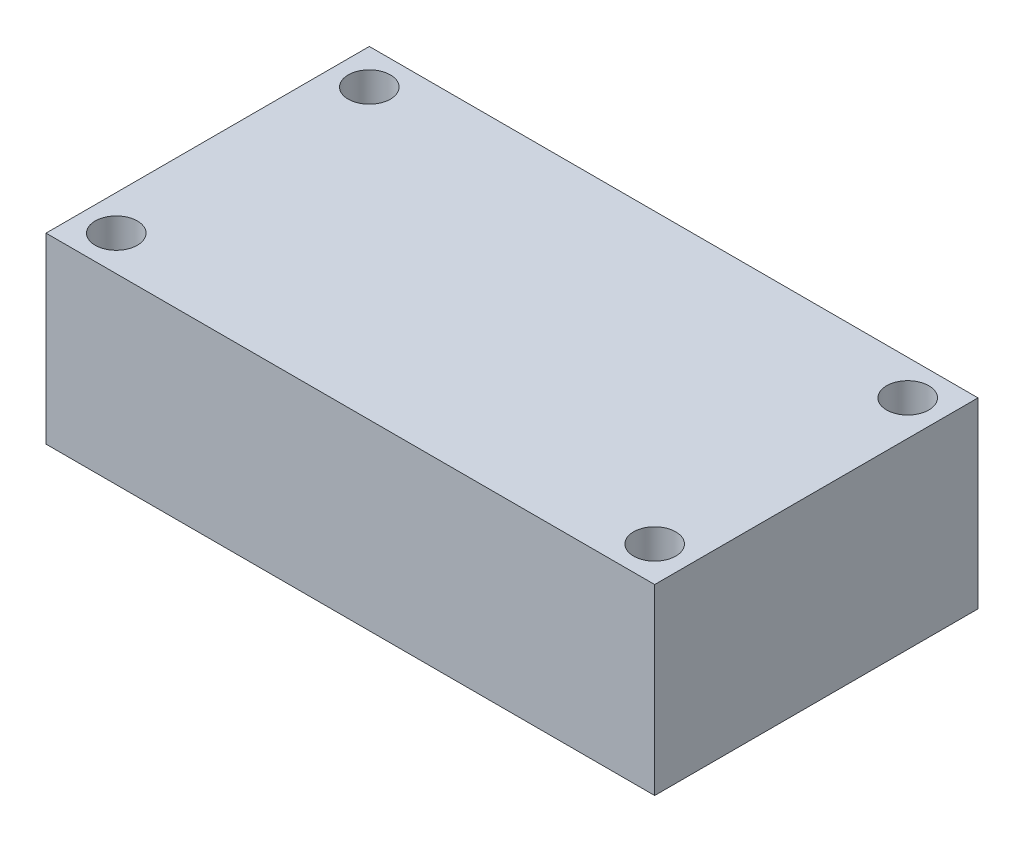
ISO-10303-21;
HEADER;
FILE_DESCRIPTION(('STEP AP214'),'2;1');
FILE_NAME('part.step','',(''),(''),'','','');
FILE_SCHEMA(('AUTOMOTIVE_DESIGN { 1 0 10303 214 1 1 1 1 }'));
ENDSEC;
DATA;
#1=APPLICATION_CONTEXT('core data for automotive mechanical design processes');
#2=APPLICATION_PROTOCOL_DEFINITION('international standard','automotive_design',2000,#1);
#3=PRODUCT_CONTEXT('',#1,'mechanical');
#4=PRODUCT('Part','Part','',(#3));
#5=PRODUCT_RELATED_PRODUCT_CATEGORY('part','',(#4));
#6=PRODUCT_DEFINITION_FORMATION('','',#4);
#7=PRODUCT_DEFINITION_CONTEXT('part definition',#1,'design');
#8=PRODUCT_DEFINITION('design','',#6,#7);
#9=PRODUCT_DEFINITION_SHAPE('','',#8);
#10=(LENGTH_UNIT() NAMED_UNIT(*) SI_UNIT(.MILLI.,.METRE.));
#11=(NAMED_UNIT(*) PLANE_ANGLE_UNIT() SI_UNIT($,.RADIAN.));
#12=(NAMED_UNIT(*) SI_UNIT($,.STERADIAN.) SOLID_ANGLE_UNIT());
#13=UNCERTAINTY_MEASURE_WITH_UNIT(LENGTH_MEASURE(1.E-05),#10,'distance_accuracy_value','');
#14=(GEOMETRIC_REPRESENTATION_CONTEXT(3) GLOBAL_UNCERTAINTY_ASSIGNED_CONTEXT((#13)) GLOBAL_UNIT_ASSIGNED_CONTEXT((#10,
#11,#12)) REPRESENTATION_CONTEXT('',''));
#15=CARTESIAN_POINT('',(0.,0.,0.));
#16=DIRECTION('',(0.,0.,1.));
#17=DIRECTION('',(1.,0.,0.));
#18=AXIS2_PLACEMENT_3D('',#15,#16,#17);
#19=CARTESIAN_POINT('',(0.,13.,0.));
#20=DIRECTION('',(0.,0.,-1.));
#21=DIRECTION('',(-1.,0.,0.));
#22=AXIS2_PLACEMENT_3D('',#19,#20,#21);
#23=PLANE('',#22);
#24=DIRECTION('',(1.,0.,0.));
#25=VECTOR('',#24,1.);
#26=CARTESIAN_POINT('',(0.,0.,0.));
#27=LINE('',#26,#25);
#28=CARTESIAN_POINT('',(0.,0.,0.));
#29=VERTEX_POINT('',#28);
#30=CARTESIAN_POINT('',(43.3,0.,0.));
#31=VERTEX_POINT('',#30);
#32=EDGE_CURVE('E131',#29,#31,#27,.T.);
#33=ORIENTED_EDGE('',*,*,#32,.T.);
#34=DIRECTION('',(0.,-1.,0.));
#35=VECTOR('',#34,1.);
#36=CARTESIAN_POINT('',(43.3,13.,0.));
#37=LINE('',#36,#35);
#38=CARTESIAN_POINT('',(43.3,13.,0.));
#39=VERTEX_POINT('',#38);
#40=EDGE_CURVE('E11',#39,#31,#37,.T.);
#41=ORIENTED_EDGE('',*,*,#40,.F.);
#42=DIRECTION('',(1.,0.,0.));
#43=VECTOR('',#42,1.);
#44=CARTESIAN_POINT('',(0.,13.,0.));
#45=LINE('',#44,#43);
#46=CARTESIAN_POINT('',(0.,13.,0.));
#47=VERTEX_POINT('',#46);
#48=EDGE_CURVE('E97',#47,#39,#45,.T.);
#49=ORIENTED_EDGE('',*,*,#48,.F.);
#50=DIRECTION('',(0.,-1.,0.));
#51=VECTOR('',#50,1.);
#52=CARTESIAN_POINT('',(0.,13.,0.));
#53=LINE('',#52,#51);
#54=EDGE_CURVE('E63',#47,#29,#53,.T.);
#55=ORIENTED_EDGE('',*,*,#54,.T.);
#56=EDGE_LOOP('',(#33,#41,#49,#55));
#57=FACE_BOUND('',#56,.T.);
#58=ADVANCED_FACE('F45',(#57),#23,.F.);
#59=CARTESIAN_POINT('',(43.3,13.,0.));
#60=DIRECTION('',(-1.,0.,0.));
#61=DIRECTION('',(0.,0.,1.));
#62=AXIS2_PLACEMENT_3D('',#59,#60,#61);
#63=PLANE('',#62);
#64=DIRECTION('',(0.,0.,-1.));
#65=VECTOR('',#64,1.);
#66=CARTESIAN_POINT('',(43.3,0.,0.));
#67=LINE('',#66,#65);
#68=CARTESIAN_POINT('',(43.3,0.,-23.));
#69=VERTEX_POINT('',#68);
#70=EDGE_CURVE('E103',#31,#69,#67,.T.);
#71=ORIENTED_EDGE('',*,*,#70,.T.);
#72=DIRECTION('',(0.,-1.,0.));
#73=VECTOR('',#72,1.);
#74=CARTESIAN_POINT('',(43.3,13.,-23.));
#75=LINE('',#74,#73);
#76=CARTESIAN_POINT('',(43.3,13.,-23.));
#77=VERTEX_POINT('',#76);
#78=EDGE_CURVE('E55',#77,#69,#75,.T.);
#79=ORIENTED_EDGE('',*,*,#78,.F.);
#80=DIRECTION('',(0.,0.,-1.));
#81=VECTOR('',#80,1.);
#82=CARTESIAN_POINT('',(43.3,13.,0.));
#83=LINE('',#82,#81);
#84=EDGE_CURVE('E88',#39,#77,#83,.T.);
#85=ORIENTED_EDGE('',*,*,#84,.F.);
#86=ORIENTED_EDGE('',*,*,#40,.T.);
#87=EDGE_LOOP('',(#71,#79,#85,#86));
#88=FACE_BOUND('',#87,.T.);
#89=ADVANCED_FACE('F102',(#88),#63,.F.);
#90=CARTESIAN_POINT('',(0.,13.,-23.));
#91=DIRECTION('',(0.,0.,-1.));
#92=DIRECTION('',(-1.,0.,0.));
#93=AXIS2_PLACEMENT_3D('',#90,#91,#92);
#94=PLANE('',#93);
#95=DIRECTION('',(1.,0.,0.));
#96=VECTOR('',#95,1.);
#97=CARTESIAN_POINT('',(0.,0.,-23.));
#98=LINE('',#97,#96);
#99=CARTESIAN_POINT('',(0.,0.,-23.));
#100=VERTEX_POINT('',#99);
#101=EDGE_CURVE('E136',#100,#69,#98,.T.);
#102=ORIENTED_EDGE('',*,*,#101,.F.);
#103=DIRECTION('',(0.,-1.,0.));
#104=VECTOR('',#103,1.);
#105=CARTESIAN_POINT('',(0.,13.,-23.));
#106=LINE('',#105,#104);
#107=CARTESIAN_POINT('',(0.,13.,-23.));
#108=VERTEX_POINT('',#107);
#109=EDGE_CURVE('E77',#108,#100,#106,.T.);
#110=ORIENTED_EDGE('',*,*,#109,.F.);
#111=DIRECTION('',(1.,0.,0.));
#112=VECTOR('',#111,1.);
#113=CARTESIAN_POINT('',(0.,13.,-23.));
#114=LINE('',#113,#112);
#115=EDGE_CURVE('E96',#108,#77,#114,.T.);
#116=ORIENTED_EDGE('',*,*,#115,.T.);
#117=ORIENTED_EDGE('',*,*,#78,.T.);
#118=EDGE_LOOP('',(#102,#110,#116,#117));
#119=FACE_BOUND('',#118,.T.);
#120=ADVANCED_FACE('F107',(#119),#94,.T.);
#121=CARTESIAN_POINT('',(0.,13.,0.));
#122=DIRECTION('',(-1.,0.,0.));
#123=DIRECTION('',(0.,0.,1.));
#124=AXIS2_PLACEMENT_3D('',#121,#122,#123);
#125=PLANE('',#124);
#126=DIRECTION('',(0.,0.,-1.));
#127=VECTOR('',#126,1.);
#128=CARTESIAN_POINT('',(0.,0.,0.));
#129=LINE('',#128,#127);
#130=EDGE_CURVE('E139',#29,#100,#129,.T.);
#131=ORIENTED_EDGE('',*,*,#130,.F.);
#132=ORIENTED_EDGE('',*,*,#54,.F.);
#133=DIRECTION('',(0.,0.,-1.));
#134=VECTOR('',#133,1.);
#135=CARTESIAN_POINT('',(0.,13.,0.));
#136=LINE('',#135,#134);
#137=EDGE_CURVE('E109',#47,#108,#136,.T.);
#138=ORIENTED_EDGE('',*,*,#137,.T.);
#139=ORIENTED_EDGE('',*,*,#109,.T.);
#140=EDGE_LOOP('',(#131,#132,#138,#139));
#141=FACE_BOUND('',#140,.T.);
#142=ADVANCED_FACE('F195',(#141),#125,.T.);
#143=CARTESIAN_POINT('',(2.5,13.,-20.5));
#144=DIRECTION('',(0.,-1.,0.));
#145=DIRECTION('',(0.,0.,-1.));
#146=AXIS2_PLACEMENT_3D('',#143,#144,#145);
#147=CYLINDRICAL_SURFACE('',#146,1.5);
#148=CARTESIAN_POINT('',(2.5,13.,-20.5));
#149=DIRECTION('',(0.,1.,0.));
#150=DIRECTION('',(0.,0.,1.));
#151=AXIS2_PLACEMENT_3D('',#148,#149,#150);
#152=CIRCLE('',#151,1.5);
#153=CARTESIAN_POINT('',(2.5,13.,-22.));
#154=VERTEX_POINT('',#153);
#155=EDGE_CURVE('E161',#154,#154,#152,.T.);
#156=CARTESIAN_POINT('',(2.5,0.,-20.5));
#157=DIRECTION('',(0.,1.,0.));
#158=DIRECTION('',(0.,0.,1.));
#159=AXIS2_PLACEMENT_3D('',#156,#157,#158);
#160=CIRCLE('',#159,1.5);
#161=CARTESIAN_POINT('',(2.5,0.,-22.));
#162=VERTEX_POINT('',#161);
#163=EDGE_CURVE('E127',#162,#162,#160,.T.);
#164=CARTESIAN_POINT('',(2.5,13.,-22.));
#165=CARTESIAN_POINT('',(2.5,12.8645833333333,-22.));
#166=CARTESIAN_POINT('',(2.5,12.7291666666667,-22.));
#167=CARTESIAN_POINT('',(2.5,12.4583333333333,-22.));
#168=CARTESIAN_POINT('',(2.5,12.3229166666667,-22.));
#169=CARTESIAN_POINT('',(2.5,12.0520833333333,-22.));
#170=CARTESIAN_POINT('',(2.5,11.9166666666667,-22.));
#171=CARTESIAN_POINT('',(2.5,11.6458333333333,-22.));
#172=CARTESIAN_POINT('',(2.5,11.5104166666667,-22.));
#173=CARTESIAN_POINT('',(2.5,11.2395833333333,-22.));
#174=CARTESIAN_POINT('',(2.5,11.1041666666667,-22.));
#175=CARTESIAN_POINT('',(2.5,10.8333333333333,-22.));
#176=CARTESIAN_POINT('',(2.5,10.6979166666667,-22.));
#177=CARTESIAN_POINT('',(2.5,10.4270833333333,-22.));
#178=CARTESIAN_POINT('',(2.5,10.2916666666667,-22.));
#179=CARTESIAN_POINT('',(2.5,10.0208333333333,-22.));
#180=CARTESIAN_POINT('',(2.5,9.88541666666667,-22.));
#181=CARTESIAN_POINT('',(2.5,9.61458333333333,-22.));
#182=CARTESIAN_POINT('',(2.5,9.47916666666667,-22.));
#183=CARTESIAN_POINT('',(2.5,9.20833333333333,-22.));
#184=CARTESIAN_POINT('',(2.5,9.07291666666666,-22.));
#185=CARTESIAN_POINT('',(2.5,8.80208333333333,-22.));
#186=CARTESIAN_POINT('',(2.5,8.66666666666667,-22.));
#187=CARTESIAN_POINT('',(2.5,8.39583333333333,-22.));
#188=CARTESIAN_POINT('',(2.5,8.26041666666667,-22.));
#189=CARTESIAN_POINT('',(2.5,7.98958333333333,-22.));
#190=CARTESIAN_POINT('',(2.5,7.85416666666667,-22.));
#191=CARTESIAN_POINT('',(2.5,7.58333333333333,-22.));
#192=CARTESIAN_POINT('',(2.5,7.44791666666667,-22.));
#193=CARTESIAN_POINT('',(2.5,7.17708333333333,-22.));
#194=CARTESIAN_POINT('',(2.5,7.04166666666667,-22.));
#195=CARTESIAN_POINT('',(2.5,6.77083333333333,-22.));
#196=CARTESIAN_POINT('',(2.5,6.63541666666667,-22.));
#197=CARTESIAN_POINT('',(2.5,6.36458333333333,-22.));
#198=CARTESIAN_POINT('',(2.5,6.22916666666667,-22.));
#199=CARTESIAN_POINT('',(2.5,5.95833333333333,-22.));
#200=CARTESIAN_POINT('',(2.5,5.82291666666667,-22.));
#201=CARTESIAN_POINT('',(2.5,5.55208333333333,-22.));
#202=CARTESIAN_POINT('',(2.5,5.41666666666667,-22.));
#203=CARTESIAN_POINT('',(2.5,5.14583333333333,-22.));
#204=CARTESIAN_POINT('',(2.5,5.01041666666667,-22.));
#205=CARTESIAN_POINT('',(2.5,4.73958333333333,-22.));
#206=CARTESIAN_POINT('',(2.5,4.60416666666667,-22.));
#207=CARTESIAN_POINT('',(2.5,4.33333333333333,-22.));
#208=CARTESIAN_POINT('',(2.5,4.19791666666667,-22.));
#209=CARTESIAN_POINT('',(2.5,3.92708333333333,-22.));
#210=CARTESIAN_POINT('',(2.5,3.79166666666667,-22.));
#211=CARTESIAN_POINT('',(2.5,3.52083333333333,-22.));
#212=CARTESIAN_POINT('',(2.5,3.38541666666667,-22.));
#213=CARTESIAN_POINT('',(2.5,3.11458333333333,-22.));
#214=CARTESIAN_POINT('',(2.5,2.97916666666667,-22.));
#215=CARTESIAN_POINT('',(2.5,2.70833333333333,-22.));
#216=CARTESIAN_POINT('',(2.5,2.57291666666667,-22.));
#217=CARTESIAN_POINT('',(2.5,2.30208333333333,-22.));
#218=CARTESIAN_POINT('',(2.5,2.16666666666667,-22.));
#219=CARTESIAN_POINT('',(2.5,1.89583333333333,-22.));
#220=CARTESIAN_POINT('',(2.5,1.76041666666667,-22.));
#221=CARTESIAN_POINT('',(2.5,1.48958333333333,-22.));
#222=CARTESIAN_POINT('',(2.5,1.35416666666667,-22.));
#223=CARTESIAN_POINT('',(2.5,1.08333333333333,-22.));
#224=CARTESIAN_POINT('',(2.5,0.947916666666667,-22.));
#225=CARTESIAN_POINT('',(2.5,0.677083333333334,-22.));
#226=CARTESIAN_POINT('',(2.5,0.541666666666667,-22.));
#227=CARTESIAN_POINT('',(2.5,0.270833333333334,-22.));
#228=CARTESIAN_POINT('',(2.5,0.135416666666667,-22.));
#229=CARTESIAN_POINT('',(2.5,0.,-22.));
#230=B_SPLINE_CURVE_WITH_KNOTS('',3,(#164,#165,#166,#167,#168,#169,#170,#171,#172,#173,#174,
#175,#176,#177,#178,#179,#180,#181,#182,#183,#184,#185,#186,#187,#188,#189,#190,#191,#192,#193,
#194,#195,#196,#197,#198,#199,#200,#201,#202,#203,#204,#205,#206,#207,#208,#209,#210,#211,#212,
#213,#214,#215,#216,#217,#218,#219,#220,#221,#222,#223,#224,#225,#226,#227,#228,#229),
.UNSPECIFIED.,.F.,.F.,(4,2,2,2,2,2,2,2,2,2,2,2,2,2,2,2,2,2,2,2,2,2,2,2,2,2,2,2,2,2,2,2,4),(0.,
0.40625,0.812500000000001,1.21875,1.625,2.03125,2.4375,2.84375,3.25,3.65625,4.0625,4.46875,
4.875,5.28125,5.6875,6.09375,6.5,6.90625,7.3125,7.71875,8.125,8.53125,8.9375,9.34375,9.75,
10.15625,10.5625,10.96875,11.375,11.78125,12.1875,12.59375,13.),.UNSPECIFIED.);
#231=EDGE_CURVE('BSEAM169',#154,#162,#230,.T.);
#232=ORIENTED_EDGE('',*,*,#155,.T.);
#233=ORIENTED_EDGE('',*,*,#163,.F.);
#234=ORIENTED_EDGE('',*,*,#231,.T.);
#235=ORIENTED_EDGE('',*,*,#231,.F.);
#236=EDGE_LOOP('',(#232,#234,#233,#235));
#237=FACE_BOUND('',#236,.T.);
#238=ADVANCED_FACE('F169',(#237),#147,.F.);
#239=CARTESIAN_POINT('',(2.5,13.,-2.5));
#240=DIRECTION('',(0.,-1.,0.));
#241=DIRECTION('',(0.,0.,-1.));
#242=AXIS2_PLACEMENT_3D('',#239,#240,#241);
#243=CYLINDRICAL_SURFACE('',#242,1.5);
#244=CARTESIAN_POINT('',(2.5,13.,-2.5));
#245=DIRECTION('',(0.,1.,0.));
#246=DIRECTION('',(0.,0.,1.));
#247=AXIS2_PLACEMENT_3D('',#244,#245,#246);
#248=CIRCLE('',#247,1.5);
#249=CARTESIAN_POINT('',(2.5,13.,-4.));
#250=VERTEX_POINT('',#249);
#251=EDGE_CURVE('E155',#250,#250,#248,.T.);
#252=CARTESIAN_POINT('',(2.5,0.,-2.5));
#253=DIRECTION('',(0.,1.,0.));
#254=DIRECTION('',(0.,0.,1.));
#255=AXIS2_PLACEMENT_3D('',#252,#253,#254);
#256=CIRCLE('',#255,1.5);
#257=CARTESIAN_POINT('',(2.5,0.,-4.));
#258=VERTEX_POINT('',#257);
#259=EDGE_CURVE('E123',#258,#258,#256,.T.);
#260=CARTESIAN_POINT('',(2.5,13.,-4.));
#261=CARTESIAN_POINT('',(2.5,12.8645833333333,-4.));
#262=CARTESIAN_POINT('',(2.5,12.7291666666667,-4.));
#263=CARTESIAN_POINT('',(2.5,12.4583333333333,-4.));
#264=CARTESIAN_POINT('',(2.5,12.3229166666667,-4.));
#265=CARTESIAN_POINT('',(2.5,12.0520833333333,-4.));
#266=CARTESIAN_POINT('',(2.5,11.9166666666667,-4.));
#267=CARTESIAN_POINT('',(2.5,11.6458333333333,-4.));
#268=CARTESIAN_POINT('',(2.5,11.5104166666667,-4.));
#269=CARTESIAN_POINT('',(2.5,11.2395833333333,-4.));
#270=CARTESIAN_POINT('',(2.5,11.1041666666667,-4.));
#271=CARTESIAN_POINT('',(2.5,10.8333333333333,-4.));
#272=CARTESIAN_POINT('',(2.5,10.6979166666667,-4.));
#273=CARTESIAN_POINT('',(2.5,10.4270833333333,-4.));
#274=CARTESIAN_POINT('',(2.5,10.2916666666667,-4.));
#275=CARTESIAN_POINT('',(2.5,10.0208333333333,-4.));
#276=CARTESIAN_POINT('',(2.5,9.88541666666667,-4.));
#277=CARTESIAN_POINT('',(2.5,9.61458333333333,-4.));
#278=CARTESIAN_POINT('',(2.5,9.47916666666667,-4.));
#279=CARTESIAN_POINT('',(2.5,9.20833333333333,-4.));
#280=CARTESIAN_POINT('',(2.5,9.07291666666666,-4.));
#281=CARTESIAN_POINT('',(2.5,8.80208333333333,-4.));
#282=CARTESIAN_POINT('',(2.5,8.66666666666667,-4.));
#283=CARTESIAN_POINT('',(2.5,8.39583333333333,-4.));
#284=CARTESIAN_POINT('',(2.5,8.26041666666667,-4.));
#285=CARTESIAN_POINT('',(2.5,7.98958333333333,-4.));
#286=CARTESIAN_POINT('',(2.5,7.85416666666667,-4.));
#287=CARTESIAN_POINT('',(2.5,7.58333333333333,-4.));
#288=CARTESIAN_POINT('',(2.5,7.44791666666667,-4.));
#289=CARTESIAN_POINT('',(2.5,7.17708333333333,-4.));
#290=CARTESIAN_POINT('',(2.5,7.04166666666667,-4.));
#291=CARTESIAN_POINT('',(2.5,6.77083333333333,-4.));
#292=CARTESIAN_POINT('',(2.5,6.63541666666667,-4.));
#293=CARTESIAN_POINT('',(2.5,6.36458333333333,-4.));
#294=CARTESIAN_POINT('',(2.5,6.22916666666667,-4.));
#295=CARTESIAN_POINT('',(2.5,5.95833333333333,-4.));
#296=CARTESIAN_POINT('',(2.5,5.82291666666667,-4.));
#297=CARTESIAN_POINT('',(2.5,5.55208333333333,-4.));
#298=CARTESIAN_POINT('',(2.5,5.41666666666667,-4.));
#299=CARTESIAN_POINT('',(2.5,5.14583333333333,-4.));
#300=CARTESIAN_POINT('',(2.5,5.01041666666667,-4.));
#301=CARTESIAN_POINT('',(2.5,4.73958333333333,-4.));
#302=CARTESIAN_POINT('',(2.5,4.60416666666667,-4.));
#303=CARTESIAN_POINT('',(2.5,4.33333333333333,-4.));
#304=CARTESIAN_POINT('',(2.5,4.19791666666667,-4.));
#305=CARTESIAN_POINT('',(2.5,3.92708333333333,-4.));
#306=CARTESIAN_POINT('',(2.5,3.79166666666667,-4.));
#307=CARTESIAN_POINT('',(2.5,3.52083333333333,-4.));
#308=CARTESIAN_POINT('',(2.5,3.38541666666667,-4.));
#309=CARTESIAN_POINT('',(2.5,3.11458333333333,-4.));
#310=CARTESIAN_POINT('',(2.5,2.97916666666667,-4.));
#311=CARTESIAN_POINT('',(2.5,2.70833333333333,-4.));
#312=CARTESIAN_POINT('',(2.5,2.57291666666667,-4.));
#313=CARTESIAN_POINT('',(2.5,2.30208333333333,-4.));
#314=CARTESIAN_POINT('',(2.5,2.16666666666667,-4.));
#315=CARTESIAN_POINT('',(2.5,1.89583333333333,-4.));
#316=CARTESIAN_POINT('',(2.5,1.76041666666667,-4.));
#317=CARTESIAN_POINT('',(2.5,1.48958333333333,-4.));
#318=CARTESIAN_POINT('',(2.5,1.35416666666667,-4.));
#319=CARTESIAN_POINT('',(2.5,1.08333333333333,-4.));
#320=CARTESIAN_POINT('',(2.5,0.947916666666667,-4.));
#321=CARTESIAN_POINT('',(2.5,0.677083333333334,-4.));
#322=CARTESIAN_POINT('',(2.5,0.541666666666667,-4.));
#323=CARTESIAN_POINT('',(2.5,0.270833333333334,-4.));
#324=CARTESIAN_POINT('',(2.5,0.135416666666667,-4.));
#325=CARTESIAN_POINT('',(2.5,0.,-4.));
#326=B_SPLINE_CURVE_WITH_KNOTS('',3,(#260,#261,#262,#263,#264,#265,#266,#267,#268,#269,#270,
#271,#272,#273,#274,#275,#276,#277,#278,#279,#280,#281,#282,#283,#284,#285,#286,#287,#288,#289,
#290,#291,#292,#293,#294,#295,#296,#297,#298,#299,#300,#301,#302,#303,#304,#305,#306,#307,#308,
#309,#310,#311,#312,#313,#314,#315,#316,#317,#318,#319,#320,#321,#322,#323,#324,#325),
.UNSPECIFIED.,.F.,.F.,(4,2,2,2,2,2,2,2,2,2,2,2,2,2,2,2,2,2,2,2,2,2,2,2,2,2,2,2,2,2,2,2,4),(0.,
0.40625,0.812500000000001,1.21875,1.625,2.03125,2.4375,2.84375,3.25,3.65625,4.0625,4.46875,
4.875,5.28125,5.6875,6.09375,6.5,6.90625,7.3125,7.71875,8.125,8.53125,8.9375,9.34375,9.75,
10.15625,10.5625,10.96875,11.375,11.78125,12.1875,12.59375,13.),.UNSPECIFIED.);
#327=EDGE_CURVE('BSEAM194',#250,#258,#326,.T.);
#328=ORIENTED_EDGE('',*,*,#251,.T.);
#329=ORIENTED_EDGE('',*,*,#259,.F.);
#330=ORIENTED_EDGE('',*,*,#327,.T.);
#331=ORIENTED_EDGE('',*,*,#327,.F.);
#332=EDGE_LOOP('',(#328,#330,#329,#331));
#333=FACE_BOUND('',#332,.T.);
#334=ADVANCED_FACE('F194',(#333),#243,.F.);
#335=CARTESIAN_POINT('',(40.8,13.,-2.5));
#336=DIRECTION('',(0.,-1.,0.));
#337=DIRECTION('',(0.,0.,-1.));
#338=AXIS2_PLACEMENT_3D('',#335,#336,#337);
#339=CYLINDRICAL_SURFACE('',#338,1.5);
#340=CARTESIAN_POINT('',(40.8,13.,-2.5));
#341=DIRECTION('',(0.,1.,0.));
#342=DIRECTION('',(0.,0.,1.));
#343=AXIS2_PLACEMENT_3D('',#340,#341,#342);
#344=CIRCLE('',#343,1.5);
#345=CARTESIAN_POINT('',(40.8,13.,-4.));
#346=VERTEX_POINT('',#345);
#347=EDGE_CURVE('E147',#346,#346,#344,.F.);
#348=CARTESIAN_POINT('',(40.8,0.,-2.5));
#349=DIRECTION('',(0.,1.,0.));
#350=DIRECTION('',(0.,0.,1.));
#351=AXIS2_PLACEMENT_3D('',#348,#349,#350);
#352=CIRCLE('',#351,1.5);
#353=CARTESIAN_POINT('',(40.8,0.,-4.));
#354=VERTEX_POINT('',#353);
#355=EDGE_CURVE('E119',#354,#354,#352,.F.);
#356=CARTESIAN_POINT('',(40.8,13.,-4.));
#357=CARTESIAN_POINT('',(40.8,12.8645833333333,-4.));
#358=CARTESIAN_POINT('',(40.8,12.7291666666667,-4.));
#359=CARTESIAN_POINT('',(40.8,12.4583333333333,-4.));
#360=CARTESIAN_POINT('',(40.8,12.3229166666667,-4.));
#361=CARTESIAN_POINT('',(40.8,12.0520833333333,-4.));
#362=CARTESIAN_POINT('',(40.8,11.9166666666667,-4.));
#363=CARTESIAN_POINT('',(40.8,11.6458333333333,-4.));
#364=CARTESIAN_POINT('',(40.8,11.5104166666667,-4.));
#365=CARTESIAN_POINT('',(40.8,11.2395833333333,-4.));
#366=CARTESIAN_POINT('',(40.8,11.1041666666667,-4.));
#367=CARTESIAN_POINT('',(40.8,10.8333333333333,-4.));
#368=CARTESIAN_POINT('',(40.8,10.6979166666667,-4.));
#369=CARTESIAN_POINT('',(40.8,10.4270833333333,-4.));
#370=CARTESIAN_POINT('',(40.8,10.2916666666667,-4.));
#371=CARTESIAN_POINT('',(40.8,10.0208333333333,-4.));
#372=CARTESIAN_POINT('',(40.8,9.88541666666667,-4.));
#373=CARTESIAN_POINT('',(40.8,9.61458333333333,-4.));
#374=CARTESIAN_POINT('',(40.8,9.47916666666667,-4.));
#375=CARTESIAN_POINT('',(40.8,9.20833333333333,-4.));
#376=CARTESIAN_POINT('',(40.8,9.07291666666666,-4.));
#377=CARTESIAN_POINT('',(40.8,8.80208333333333,-4.));
#378=CARTESIAN_POINT('',(40.8,8.66666666666667,-4.));
#379=CARTESIAN_POINT('',(40.8,8.39583333333333,-4.));
#380=CARTESIAN_POINT('',(40.8,8.26041666666667,-4.));
#381=CARTESIAN_POINT('',(40.8,7.98958333333333,-4.));
#382=CARTESIAN_POINT('',(40.8,7.85416666666667,-4.));
#383=CARTESIAN_POINT('',(40.8,7.58333333333333,-4.));
#384=CARTESIAN_POINT('',(40.8,7.44791666666667,-4.));
#385=CARTESIAN_POINT('',(40.8,7.17708333333333,-4.));
#386=CARTESIAN_POINT('',(40.8,7.04166666666667,-4.));
#387=CARTESIAN_POINT('',(40.8,6.77083333333333,-4.));
#388=CARTESIAN_POINT('',(40.8,6.63541666666667,-4.));
#389=CARTESIAN_POINT('',(40.8,6.36458333333333,-4.));
#390=CARTESIAN_POINT('',(40.8,6.22916666666667,-4.));
#391=CARTESIAN_POINT('',(40.8,5.95833333333333,-4.));
#392=CARTESIAN_POINT('',(40.8,5.82291666666667,-4.));
#393=CARTESIAN_POINT('',(40.8,5.55208333333333,-4.));
#394=CARTESIAN_POINT('',(40.8,5.41666666666667,-4.));
#395=CARTESIAN_POINT('',(40.8,5.14583333333333,-4.));
#396=CARTESIAN_POINT('',(40.8,5.01041666666667,-4.));
#397=CARTESIAN_POINT('',(40.8,4.73958333333333,-4.));
#398=CARTESIAN_POINT('',(40.8,4.60416666666667,-4.));
#399=CARTESIAN_POINT('',(40.8,4.33333333333333,-4.));
#400=CARTESIAN_POINT('',(40.8,4.19791666666667,-4.));
#401=CARTESIAN_POINT('',(40.8,3.92708333333333,-4.));
#402=CARTESIAN_POINT('',(40.8,3.79166666666667,-4.));
#403=CARTESIAN_POINT('',(40.8,3.52083333333333,-4.));
#404=CARTESIAN_POINT('',(40.8,3.38541666666667,-4.));
#405=CARTESIAN_POINT('',(40.8,3.11458333333333,-4.));
#406=CARTESIAN_POINT('',(40.8,2.97916666666667,-4.));
#407=CARTESIAN_POINT('',(40.8,2.70833333333333,-4.));
#408=CARTESIAN_POINT('',(40.8,2.57291666666667,-4.));
#409=CARTESIAN_POINT('',(40.8,2.30208333333333,-4.));
#410=CARTESIAN_POINT('',(40.8,2.16666666666667,-4.));
#411=CARTESIAN_POINT('',(40.8,1.89583333333333,-4.));
#412=CARTESIAN_POINT('',(40.8,1.76041666666667,-4.));
#413=CARTESIAN_POINT('',(40.8,1.48958333333333,-4.));
#414=CARTESIAN_POINT('',(40.8,1.35416666666667,-4.));
#415=CARTESIAN_POINT('',(40.8,1.08333333333333,-4.));
#416=CARTESIAN_POINT('',(40.8,0.947916666666667,-4.));
#417=CARTESIAN_POINT('',(40.8,0.677083333333334,-4.));
#418=CARTESIAN_POINT('',(40.8,0.541666666666667,-4.));
#419=CARTESIAN_POINT('',(40.8,0.270833333333334,-4.));
#420=CARTESIAN_POINT('',(40.8,0.135416666666667,-4.));
#421=CARTESIAN_POINT('',(40.8,0.,-4.));
#422=B_SPLINE_CURVE_WITH_KNOTS('',3,(#356,#357,#358,#359,#360,#361,#362,#363,#364,#365,#366,
#367,#368,#369,#370,#371,#372,#373,#374,#375,#376,#377,#378,#379,#380,#381,#382,#383,#384,#385,
#386,#387,#388,#389,#390,#391,#392,#393,#394,#395,#396,#397,#398,#399,#400,#401,#402,#403,#404,
#405,#406,#407,#408,#409,#410,#411,#412,#413,#414,#415,#416,#417,#418,#419,#420,#421),
.UNSPECIFIED.,.F.,.F.,(4,2,2,2,2,2,2,2,2,2,2,2,2,2,2,2,2,2,2,2,2,2,2,2,2,2,2,2,2,2,2,2,4),(0.,
0.40625,0.812500000000001,1.21875,1.625,2.03125,2.4375,2.84375,3.25,3.65625,4.0625,4.46875,
4.875,5.28125,5.6875,6.09375,6.5,6.90625,7.3125,7.71875,8.125,8.53125,8.9375,9.34375,9.75,
10.15625,10.5625,10.96875,11.375,11.78125,12.1875,12.59375,13.),.UNSPECIFIED.);
#423=EDGE_CURVE('BSEAM47',#346,#354,#422,.T.);
#424=ORIENTED_EDGE('',*,*,#347,.F.);
#425=ORIENTED_EDGE('',*,*,#355,.T.);
#426=ORIENTED_EDGE('',*,*,#423,.T.);
#427=ORIENTED_EDGE('',*,*,#423,.F.);
#428=EDGE_LOOP('',(#424,#426,#425,#427));
#429=FACE_BOUND('',#428,.T.);
#430=ADVANCED_FACE('F47',(#429),#339,.F.);
#431=CARTESIAN_POINT('',(40.8,13.,-20.5));
#432=DIRECTION('',(0.,-1.,0.));
#433=DIRECTION('',(0.,0.,-1.));
#434=AXIS2_PLACEMENT_3D('',#431,#432,#433);
#435=CYLINDRICAL_SURFACE('',#434,1.5);
#436=CARTESIAN_POINT('',(40.8,13.,-20.5));
#437=DIRECTION('',(0.,1.,0.));
#438=DIRECTION('',(0.,0.,1.));
#439=AXIS2_PLACEMENT_3D('',#436,#437,#438);
#440=CIRCLE('',#439,1.5);
#441=CARTESIAN_POINT('',(40.8,13.,-22.));
#442=VERTEX_POINT('',#441);
#443=EDGE_CURVE('E112',#442,#442,#440,.F.);
#444=CARTESIAN_POINT('',(40.8,0.,-20.5));
#445=DIRECTION('',(0.,1.,0.));
#446=DIRECTION('',(0.,0.,1.));
#447=AXIS2_PLACEMENT_3D('',#444,#445,#446);
#448=CIRCLE('',#447,1.5);
#449=CARTESIAN_POINT('',(40.8,0.,-22.));
#450=VERTEX_POINT('',#449);
#451=EDGE_CURVE('E143',#450,#450,#448,.F.);
#452=CARTESIAN_POINT('',(40.8,13.,-22.));
#453=CARTESIAN_POINT('',(40.8,12.8645833333333,-22.));
#454=CARTESIAN_POINT('',(40.8,12.7291666666667,-22.));
#455=CARTESIAN_POINT('',(40.8,12.4583333333333,-22.));
#456=CARTESIAN_POINT('',(40.8,12.3229166666667,-22.));
#457=CARTESIAN_POINT('',(40.8,12.0520833333333,-22.));
#458=CARTESIAN_POINT('',(40.8,11.9166666666667,-22.));
#459=CARTESIAN_POINT('',(40.8,11.6458333333333,-22.));
#460=CARTESIAN_POINT('',(40.8,11.5104166666667,-22.));
#461=CARTESIAN_POINT('',(40.8,11.2395833333333,-22.));
#462=CARTESIAN_POINT('',(40.8,11.1041666666667,-22.));
#463=CARTESIAN_POINT('',(40.8,10.8333333333333,-22.));
#464=CARTESIAN_POINT('',(40.8,10.6979166666667,-22.));
#465=CARTESIAN_POINT('',(40.8,10.4270833333333,-22.));
#466=CARTESIAN_POINT('',(40.8,10.2916666666667,-22.));
#467=CARTESIAN_POINT('',(40.8,10.0208333333333,-22.));
#468=CARTESIAN_POINT('',(40.8,9.88541666666667,-22.));
#469=CARTESIAN_POINT('',(40.8,9.61458333333333,-22.));
#470=CARTESIAN_POINT('',(40.8,9.47916666666667,-22.));
#471=CARTESIAN_POINT('',(40.8,9.20833333333333,-22.));
#472=CARTESIAN_POINT('',(40.8,9.07291666666666,-22.));
#473=CARTESIAN_POINT('',(40.8,8.80208333333333,-22.));
#474=CARTESIAN_POINT('',(40.8,8.66666666666667,-22.));
#475=CARTESIAN_POINT('',(40.8,8.39583333333333,-22.));
#476=CARTESIAN_POINT('',(40.8,8.26041666666667,-22.));
#477=CARTESIAN_POINT('',(40.8,7.98958333333333,-22.));
#478=CARTESIAN_POINT('',(40.8,7.85416666666667,-22.));
#479=CARTESIAN_POINT('',(40.8,7.58333333333333,-22.));
#480=CARTESIAN_POINT('',(40.8,7.44791666666667,-22.));
#481=CARTESIAN_POINT('',(40.8,7.17708333333333,-22.));
#482=CARTESIAN_POINT('',(40.8,7.04166666666667,-22.));
#483=CARTESIAN_POINT('',(40.8,6.77083333333333,-22.));
#484=CARTESIAN_POINT('',(40.8,6.63541666666667,-22.));
#485=CARTESIAN_POINT('',(40.8,6.36458333333333,-22.));
#486=CARTESIAN_POINT('',(40.8,6.22916666666667,-22.));
#487=CARTESIAN_POINT('',(40.8,5.95833333333333,-22.));
#488=CARTESIAN_POINT('',(40.8,5.82291666666667,-22.));
#489=CARTESIAN_POINT('',(40.8,5.55208333333333,-22.));
#490=CARTESIAN_POINT('',(40.8,5.41666666666667,-22.));
#491=CARTESIAN_POINT('',(40.8,5.14583333333333,-22.));
#492=CARTESIAN_POINT('',(40.8,5.01041666666667,-22.));
#493=CARTESIAN_POINT('',(40.8,4.73958333333333,-22.));
#494=CARTESIAN_POINT('',(40.8,4.60416666666667,-22.));
#495=CARTESIAN_POINT('',(40.8,4.33333333333333,-22.));
#496=CARTESIAN_POINT('',(40.8,4.19791666666667,-22.));
#497=CARTESIAN_POINT('',(40.8,3.92708333333333,-22.));
#498=CARTESIAN_POINT('',(40.8,3.79166666666667,-22.));
#499=CARTESIAN_POINT('',(40.8,3.52083333333333,-22.));
#500=CARTESIAN_POINT('',(40.8,3.38541666666667,-22.));
#501=CARTESIAN_POINT('',(40.8,3.11458333333333,-22.));
#502=CARTESIAN_POINT('',(40.8,2.97916666666667,-22.));
#503=CARTESIAN_POINT('',(40.8,2.70833333333333,-22.));
#504=CARTESIAN_POINT('',(40.8,2.57291666666667,-22.));
#505=CARTESIAN_POINT('',(40.8,2.30208333333333,-22.));
#506=CARTESIAN_POINT('',(40.8,2.16666666666667,-22.));
#507=CARTESIAN_POINT('',(40.8,1.89583333333333,-22.));
#508=CARTESIAN_POINT('',(40.8,1.76041666666667,-22.));
#509=CARTESIAN_POINT('',(40.8,1.48958333333333,-22.));
#510=CARTESIAN_POINT('',(40.8,1.35416666666667,-22.));
#511=CARTESIAN_POINT('',(40.8,1.08333333333333,-22.));
#512=CARTESIAN_POINT('',(40.8,0.947916666666667,-22.));
#513=CARTESIAN_POINT('',(40.8,0.677083333333334,-22.));
#514=CARTESIAN_POINT('',(40.8,0.541666666666667,-22.));
#515=CARTESIAN_POINT('',(40.8,0.270833333333334,-22.));
#516=CARTESIAN_POINT('',(40.8,0.135416666666667,-22.));
#517=CARTESIAN_POINT('',(40.8,0.,-22.));
#518=B_SPLINE_CURVE_WITH_KNOTS('',3,(#452,#453,#454,#455,#456,#457,#458,#459,#460,#461,#462,
#463,#464,#465,#466,#467,#468,#469,#470,#471,#472,#473,#474,#475,#476,#477,#478,#479,#480,#481,
#482,#483,#484,#485,#486,#487,#488,#489,#490,#491,#492,#493,#494,#495,#496,#497,#498,#499,#500,
#501,#502,#503,#504,#505,#506,#507,#508,#509,#510,#511,#512,#513,#514,#515,#516,#517),
.UNSPECIFIED.,.F.,.F.,(4,2,2,2,2,2,2,2,2,2,2,2,2,2,2,2,2,2,2,2,2,2,2,2,2,2,2,2,2,2,2,2,4),(0.,
0.40625,0.812500000000001,1.21875,1.625,2.03125,2.4375,2.84375,3.25,3.65625,4.0625,4.46875,
4.875,5.28125,5.6875,6.09375,6.5,6.90625,7.3125,7.71875,8.125,8.53125,8.9375,9.34375,9.75,
10.15625,10.5625,10.96875,11.375,11.78125,12.1875,12.59375,13.),.UNSPECIFIED.);
#519=EDGE_CURVE('BSEAM174',#442,#450,#518,.T.);
#520=ORIENTED_EDGE('',*,*,#443,.F.);
#521=ORIENTED_EDGE('',*,*,#451,.T.);
#522=ORIENTED_EDGE('',*,*,#519,.T.);
#523=ORIENTED_EDGE('',*,*,#519,.F.);
#524=EDGE_LOOP('',(#520,#522,#521,#523));
#525=FACE_BOUND('',#524,.T.);
#526=ADVANCED_FACE('F174',(#525),#435,.F.);
#527=CARTESIAN_POINT('',(0.,13.,0.));
#528=DIRECTION('',(0.,1.,0.));
#529=DIRECTION('',(0.,0.,1.));
#530=AXIS2_PLACEMENT_3D('',#527,#528,#529);
#531=PLANE('',#530);
#532=ORIENTED_EDGE('',*,*,#347,.T.);
#533=EDGE_LOOP('',(#532));
#534=FACE_BOUND('',#533,.T.);
#535=ORIENTED_EDGE('',*,*,#251,.F.);
#536=EDGE_LOOP('',(#535));
#537=FACE_BOUND('',#536,.T.);
#538=ORIENTED_EDGE('',*,*,#155,.F.);
#539=EDGE_LOOP('',(#538));
#540=FACE_BOUND('',#539,.T.);
#541=ORIENTED_EDGE('',*,*,#48,.T.);
#542=ORIENTED_EDGE('',*,*,#84,.T.);
#543=ORIENTED_EDGE('',*,*,#115,.F.);
#544=ORIENTED_EDGE('',*,*,#137,.F.);
#545=EDGE_LOOP('',(#541,#542,#543,#544));
#546=FACE_BOUND('',#545,.T.);
#547=ORIENTED_EDGE('',*,*,#443,.T.);
#548=EDGE_LOOP('',(#547));
#549=FACE_BOUND('',#548,.T.);
#550=ADVANCED_FACE('F92',(#534,#537,#540,#546,#549),#531,.T.);
#551=CARTESIAN_POINT('',(0.,0.,0.));
#552=DIRECTION('',(0.,1.,0.));
#553=DIRECTION('',(0.,0.,1.));
#554=AXIS2_PLACEMENT_3D('',#551,#552,#553);
#555=PLANE('',#554);
#556=ORIENTED_EDGE('',*,*,#355,.F.);
#557=EDGE_LOOP('',(#556));
#558=FACE_BOUND('',#557,.T.);
#559=ORIENTED_EDGE('',*,*,#259,.T.);
#560=EDGE_LOOP('',(#559));
#561=FACE_BOUND('',#560,.T.);
#562=ORIENTED_EDGE('',*,*,#163,.T.);
#563=EDGE_LOOP('',(#562));
#564=FACE_BOUND('',#563,.T.);
#565=ORIENTED_EDGE('',*,*,#32,.F.);
#566=ORIENTED_EDGE('',*,*,#130,.T.);
#567=ORIENTED_EDGE('',*,*,#101,.T.);
#568=ORIENTED_EDGE('',*,*,#70,.F.);
#569=EDGE_LOOP('',(#565,#566,#567,#568));
#570=FACE_BOUND('',#569,.T.);
#571=ORIENTED_EDGE('',*,*,#451,.F.);
#572=EDGE_LOOP('',(#571));
#573=FACE_BOUND('',#572,.T.);
#574=ADVANCED_FACE('F173',(#558,#561,#564,#570,#573),#555,.F.);
#575=CLOSED_SHELL('',(#58,#89,#120,#142,#238,#334,#430,#526,#550,#574));
#576=MANIFOLD_SOLID_BREP('B2',#575);
#577=ADVANCED_BREP_SHAPE_REPRESENTATION('',(#18,#576),#14);
#578=SHAPE_DEFINITION_REPRESENTATION(#9,#577);
ENDSEC;
END-ISO-10303-21;
